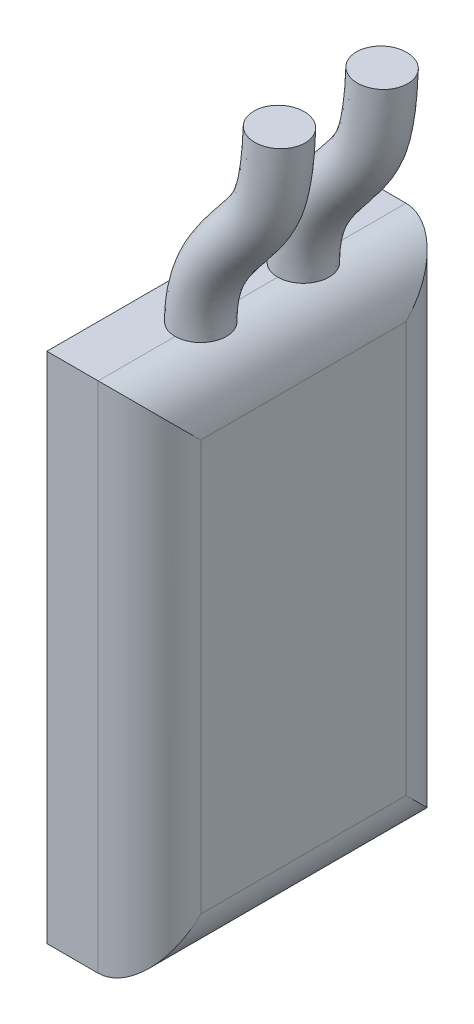
ISO-10303-21;
HEADER;
FILE_DESCRIPTION(('STEP AP214'),'2;1');
FILE_NAME('part.step','',(''),(''),'','','');
FILE_SCHEMA(('AUTOMOTIVE_DESIGN { 1 0 10303 214 1 1 1 1 }'));
ENDSEC;
DATA;
#1=APPLICATION_CONTEXT('core data for automotive mechanical design processes');
#2=APPLICATION_PROTOCOL_DEFINITION('international standard','automotive_design',2000,#1);
#3=PRODUCT_CONTEXT('',#1,'mechanical');
#4=PRODUCT('Part','Part','',(#3));
#5=PRODUCT_RELATED_PRODUCT_CATEGORY('part','',(#4));
#6=PRODUCT_DEFINITION_FORMATION('','',#4);
#7=PRODUCT_DEFINITION_CONTEXT('part definition',#1,'design');
#8=PRODUCT_DEFINITION('design','',#6,#7);
#9=PRODUCT_DEFINITION_SHAPE('','',#8);
#10=(LENGTH_UNIT() NAMED_UNIT(*) SI_UNIT(.MILLI.,.METRE.));
#11=(NAMED_UNIT(*) PLANE_ANGLE_UNIT() SI_UNIT($,.RADIAN.));
#12=(NAMED_UNIT(*) SI_UNIT($,.STERADIAN.) SOLID_ANGLE_UNIT());
#13=UNCERTAINTY_MEASURE_WITH_UNIT(LENGTH_MEASURE(1.E-05),#10,'distance_accuracy_value','');
#14=(GEOMETRIC_REPRESENTATION_CONTEXT(3) GLOBAL_UNCERTAINTY_ASSIGNED_CONTEXT((#13)) GLOBAL_UNIT_ASSIGNED_CONTEXT((#10,
#11,#12)) REPRESENTATION_CONTEXT('',''));
#15=CARTESIAN_POINT('',(0.,0.,0.));
#16=DIRECTION('',(0.,0.,1.));
#17=DIRECTION('',(1.,0.,0.));
#18=AXIS2_PLACEMENT_3D('',#15,#16,#17);
#19=CARTESIAN_POINT('',(1.48423307474751,-5.,-2.88901919499787));
#20=DIRECTION('',(1.,0.,0.));
#21=DIRECTION('',(0.,0.,-1.));
#22=AXIS2_PLACEMENT_3D('',#19,#20,#21);
#23=PLANE('',#22);
#24=DIRECTION('',(0.,0.,-1.));
#25=VECTOR('',#24,1.);
#26=CARTESIAN_POINT('',(1.48423307474751,-4.5,-2.88901919499787));
#27=LINE('',#26,#25);
#28=CARTESIAN_POINT('',(1.48423307474751,-4.5,-0.389019194997869));
#29=VERTEX_POINT('',#28);
#30=CARTESIAN_POINT('',(1.48423307474751,-4.5,-2.38901919499787));
#31=VERTEX_POINT('',#30);
#32=EDGE_CURVE('E153',#29,#31,#27,.T.);
#33=ORIENTED_EDGE('',*,*,#32,.T.);
#34=DIRECTION('',(0.,1.,0.));
#35=VECTOR('',#34,1.);
#36=CARTESIAN_POINT('',(1.48423307474751,-5.,-2.38901919499787));
#37=LINE('',#36,#35);
#38=CARTESIAN_POINT('',(1.48423307474751,-0.5,-2.38901919499787));
#39=VERTEX_POINT('',#38);
#40=EDGE_CURVE('E155',#31,#39,#37,.T.);
#41=ORIENTED_EDGE('',*,*,#40,.T.);
#42=DIRECTION('',(0.,0.,-1.));
#43=VECTOR('',#42,1.);
#44=CARTESIAN_POINT('',(1.48423307474751,-0.5,0.110980805002131));
#45=LINE('',#44,#43);
#46=CARTESIAN_POINT('',(1.48423307474751,-0.5,-0.389019194997869));
#47=VERTEX_POINT('',#46);
#48=EDGE_CURVE('E147',#39,#47,#45,.F.);
#49=ORIENTED_EDGE('',*,*,#48,.T.);
#50=DIRECTION('',(0.,1.,0.));
#51=VECTOR('',#50,1.);
#52=CARTESIAN_POINT('',(1.48423307474751,-5.,-0.389019194997869));
#53=LINE('',#52,#51);
#54=EDGE_CURVE('E151',#47,#29,#53,.F.);
#55=ORIENTED_EDGE('',*,*,#54,.T.);
#56=EDGE_LOOP('',(#33,#41,#49,#55));
#57=FACE_BOUND('',#56,.T.);
#58=ADVANCED_FACE('F35',(#57),#23,.T.);
#59=CARTESIAN_POINT('',(1.48423307474751,-5.,0.110980805002131));
#60=DIRECTION('',(0.,0.,1.));
#61=DIRECTION('',(1.,0.,0.));
#62=AXIS2_PLACEMENT_3D('',#59,#60,#61);
#63=PLANE('',#62);
#64=DIRECTION('',(1.,0.,0.));
#65=VECTOR('',#64,1.);
#66=CARTESIAN_POINT('',(1.48423307474751,-5.,0.110980805002131));
#67=LINE('',#66,#65);
#68=CARTESIAN_POINT('',(0.48423307474751,-5.,0.110980805002131));
#69=VERTEX_POINT('',#68);
#70=CARTESIAN_POINT('',(0.98423307474751,-5.,0.110980805002131));
#71=VERTEX_POINT('',#70);
#72=EDGE_CURVE('E134',#69,#71,#67,.T.);
#73=ORIENTED_EDGE('',*,*,#72,.T.);
#74=DIRECTION('',(0.,1.,0.));
#75=VECTOR('',#74,1.);
#76=CARTESIAN_POINT('',(0.98423307474751,-5.,0.110980805002131));
#77=LINE('',#76,#75);
#78=CARTESIAN_POINT('',(0.98423307474751,0.,0.110980805002131));
#79=VERTEX_POINT('',#78);
#80=EDGE_CURVE('E106',#71,#79,#77,.T.);
#81=ORIENTED_EDGE('',*,*,#80,.T.);
#82=DIRECTION('',(1.,0.,0.));
#83=VECTOR('',#82,1.);
#84=CARTESIAN_POINT('',(1.48423307474751,0.,0.110980805002131));
#85=LINE('',#84,#83);
#86=CARTESIAN_POINT('',(0.48423307474751,0.,0.110980805002131));
#87=VERTEX_POINT('',#86);
#88=EDGE_CURVE('E131',#87,#79,#85,.T.);
#89=ORIENTED_EDGE('',*,*,#88,.F.);
#90=DIRECTION('',(0.,1.,0.));
#91=VECTOR('',#90,1.);
#92=CARTESIAN_POINT('',(0.48423307474751,-5.,0.110980805002131));
#93=LINE('',#92,#91);
#94=EDGE_CURVE('E145',#69,#87,#93,.T.);
#95=ORIENTED_EDGE('',*,*,#94,.F.);
#96=EDGE_LOOP('',(#73,#81,#89,#95));
#97=FACE_BOUND('',#96,.T.);
#98=ADVANCED_FACE('F182',(#97),#63,.T.);
#99=CARTESIAN_POINT('',(0.48423307474751,-5.,-2.88901919499787));
#100=DIRECTION('',(-1.,0.,0.));
#101=DIRECTION('',(0.,0.,1.));
#102=AXIS2_PLACEMENT_3D('',#99,#100,#101);
#103=PLANE('',#102);
#104=DIRECTION('',(0.,0.,1.));
#105=VECTOR('',#104,1.);
#106=CARTESIAN_POINT('',(0.48423307474751,0.,-2.88901919499787));
#107=LINE('',#106,#105);
#108=CARTESIAN_POINT('',(0.48423307474751,0.,-2.88901919499787));
#109=VERTEX_POINT('',#108);
#110=EDGE_CURVE('E140',#109,#87,#107,.T.);
#111=ORIENTED_EDGE('',*,*,#110,.F.);
#112=DIRECTION('',(0.,1.,0.));
#113=VECTOR('',#112,1.);
#114=CARTESIAN_POINT('',(0.48423307474751,-5.,-2.88901919499787));
#115=LINE('',#114,#113);
#116=CARTESIAN_POINT('',(0.48423307474751,-5.,-2.88901919499787));
#117=VERTEX_POINT('',#116);
#118=EDGE_CURVE('E137',#117,#109,#115,.T.);
#119=ORIENTED_EDGE('',*,*,#118,.F.);
#120=DIRECTION('',(0.,0.,1.));
#121=VECTOR('',#120,1.);
#122=CARTESIAN_POINT('',(0.48423307474751,-5.,-2.88901919499787));
#123=LINE('',#122,#121);
#124=EDGE_CURVE('E130',#117,#69,#123,.T.);
#125=ORIENTED_EDGE('',*,*,#124,.T.);
#126=ORIENTED_EDGE('',*,*,#94,.T.);
#127=EDGE_LOOP('',(#111,#119,#125,#126));
#128=FACE_BOUND('',#127,.T.);
#129=ADVANCED_FACE('F188',(#128),#103,.T.);
#130=CARTESIAN_POINT('',(1.48423307474751,-5.,-2.88901919499787));
#131=DIRECTION('',(0.,0.,-1.));
#132=DIRECTION('',(-1.,0.,0.));
#133=AXIS2_PLACEMENT_3D('',#130,#131,#132);
#134=PLANE('',#133);
#135=DIRECTION('',(-1.,0.,0.));
#136=VECTOR('',#135,1.);
#137=CARTESIAN_POINT('',(1.48423307474751,0.,-2.88901919499787));
#138=LINE('',#137,#136);
#139=CARTESIAN_POINT('',(0.98423307474751,0.,-2.88901919499787));
#140=VERTEX_POINT('',#139);
#141=EDGE_CURVE('E138',#140,#109,#138,.T.);
#142=ORIENTED_EDGE('',*,*,#141,.F.);
#143=DIRECTION('',(0.,1.,0.));
#144=VECTOR('',#143,1.);
#145=CARTESIAN_POINT('',(0.98423307474751,-5.,-2.88901919499787));
#146=LINE('',#145,#144);
#147=CARTESIAN_POINT('',(0.98423307474751,-5.,-2.88901919499787));
#148=VERTEX_POINT('',#147);
#149=EDGE_CURVE('E158',#140,#148,#146,.F.);
#150=ORIENTED_EDGE('',*,*,#149,.T.);
#151=DIRECTION('',(-1.,0.,0.));
#152=VECTOR('',#151,1.);
#153=CARTESIAN_POINT('',(1.48423307474751,-5.,-2.88901919499787));
#154=LINE('',#153,#152);
#155=EDGE_CURVE('E128',#148,#117,#154,.T.);
#156=ORIENTED_EDGE('',*,*,#155,.T.);
#157=ORIENTED_EDGE('',*,*,#118,.T.);
#158=EDGE_LOOP('',(#142,#150,#156,#157));
#159=FACE_BOUND('',#158,.T.);
#160=ADVANCED_FACE('F194',(#159),#134,.T.);
#161=CARTESIAN_POINT('',(0.,-5.,0.));
#162=DIRECTION('',(0.,-1.,0.));
#163=DIRECTION('',(0.,0.,-1.));
#164=AXIS2_PLACEMENT_3D('',#161,#162,#163);
#165=PLANE('',#164);
#166=ORIENTED_EDGE('',*,*,#155,.F.);
#167=DIRECTION('',(0.,0.,-1.));
#168=VECTOR('',#167,1.);
#169=CARTESIAN_POINT('',(0.98423307474751,-5.,0.));
#170=LINE('',#169,#168);
#171=EDGE_CURVE('E161',#148,#71,#170,.F.);
#172=ORIENTED_EDGE('',*,*,#171,.T.);
#173=ORIENTED_EDGE('',*,*,#72,.F.);
#174=ORIENTED_EDGE('',*,*,#124,.F.);
#175=EDGE_LOOP('',(#166,#172,#173,#174));
#176=FACE_BOUND('',#175,.T.);
#177=ADVANCED_FACE('F192',(#176),#165,.T.);
#178=CARTESIAN_POINT('',(0.,0.,0.));
#179=DIRECTION('',(0.,-1.,0.));
#180=DIRECTION('',(0.,0.,-1.));
#181=AXIS2_PLACEMENT_3D('',#178,#179,#180);
#182=PLANE('',#181);
#183=DIRECTION('',(0.,0.,-1.));
#184=VECTOR('',#183,1.);
#185=CARTESIAN_POINT('',(0.98423307474751,0.,-2.88901919499787));
#186=LINE('',#185,#184);
#187=CARTESIAN_POINT('',(0.98423307474751,0.,-1.13901919499787));
#188=VERTEX_POINT('',#187);
#189=CARTESIAN_POINT('',(0.98423307474751,0.,-1.63901919499787));
#190=VERTEX_POINT('',#189);
#191=EDGE_CURVE('E111',#188,#190,#186,.T.);
#192=ORIENTED_EDGE('',*,*,#191,.T.);
#193=CARTESIAN_POINT('',(0.98423307474751,0.,-1.88901919499787));
#194=DIRECTION('',(0.,1.,0.));
#195=DIRECTION('',(0.,0.,1.));
#196=AXIS2_PLACEMENT_3D('',#193,#194,#195);
#197=CIRCLE('',#196,0.25);
#198=CARTESIAN_POINT('',(0.98423307474751,0.,-2.13901919499787));
#199=VERTEX_POINT('',#198);
#200=EDGE_CURVE('E109',#199,#190,#197,.T.);
#201=ORIENTED_EDGE('',*,*,#200,.F.);
#202=EDGE_CURVE('E99',#199,#140,#186,.T.);
#203=ORIENTED_EDGE('',*,*,#202,.T.);
#204=ORIENTED_EDGE('',*,*,#141,.T.);
#205=ORIENTED_EDGE('',*,*,#110,.T.);
#206=ORIENTED_EDGE('',*,*,#88,.T.);
#207=CARTESIAN_POINT('',(0.98423307474751,0.,-0.63901919499787));
#208=VERTEX_POINT('',#207);
#209=EDGE_CURVE('E44',#79,#208,#186,.T.);
#210=ORIENTED_EDGE('',*,*,#209,.T.);
#211=CARTESIAN_POINT('',(0.98423307474751,0.,-0.889019194997869));
#212=DIRECTION('',(0.,1.,0.));
#213=DIRECTION('',(0.,0.,1.));
#214=AXIS2_PLACEMENT_3D('',#211,#212,#213);
#215=CIRCLE('',#214,0.25);
#216=EDGE_CURVE('E11',#188,#208,#215,.T.);
#217=ORIENTED_EDGE('',*,*,#216,.F.);
#218=EDGE_LOOP('',(#192,#201,#203,#204,#205,#206,#210,#217));
#219=FACE_BOUND('',#218,.T.);
#220=ADVANCED_FACE('F110',(#219),#182,.F.);
#221=CARTESIAN_POINT('',(0.98423307474751,-5.,-0.389019194997869));
#222=DIRECTION('',(0.,1.,0.));
#223=DIRECTION('',(0.,0.,1.));
#224=AXIS2_PLACEMENT_3D('',#221,#222,#223);
#225=CYLINDRICAL_SURFACE('',#224,0.5);
#226=CARTESIAN_POINT('',(0.98423307474751,-0.5,-0.389019194997869));
#227=DIRECTION('',(0.,-0.707106781186547,0.707106781186547));
#228=DIRECTION('',(0.,0.707106781186547,0.707106781186547));
#229=AXIS2_PLACEMENT_3D('',#226,#227,#228);
#230=ELLIPSE('',#229,0.707106781186547,0.5);
#231=EDGE_CURVE('E167',#79,#47,#230,.F.);
#232=ORIENTED_EDGE('',*,*,#231,.F.);
#233=ORIENTED_EDGE('',*,*,#80,.F.);
#234=CARTESIAN_POINT('',(0.98423307474751,-4.5,-0.389019194997869));
#235=DIRECTION('',(0.,0.707106781186547,0.707106781186547));
#236=DIRECTION('',(0.,0.707106781186547,-0.707106781186547));
#237=AXIS2_PLACEMENT_3D('',#234,#235,#236);
#238=ELLIPSE('',#237,0.707106781186547,0.5);
#239=EDGE_CURVE('E39',#29,#71,#238,.F.);
#240=ORIENTED_EDGE('',*,*,#239,.F.);
#241=ORIENTED_EDGE('',*,*,#54,.F.);
#242=EDGE_LOOP('',(#232,#233,#240,#241));
#243=FACE_BOUND('',#242,.T.);
#244=ADVANCED_FACE('F37',(#243),#225,.T.);
#245=CARTESIAN_POINT('',(0.98423307474751,-4.5,-2.88901919499787));
#246=DIRECTION('',(0.,0.,-1.));
#247=DIRECTION('',(-1.,0.,0.));
#248=AXIS2_PLACEMENT_3D('',#245,#246,#247);
#249=CYLINDRICAL_SURFACE('',#248,0.5);
#250=ORIENTED_EDGE('',*,*,#239,.T.);
#251=ORIENTED_EDGE('',*,*,#171,.F.);
#252=CARTESIAN_POINT('',(0.98423307474751,-4.5,-2.38901919499787));
#253=DIRECTION('',(0.,0.707106781186547,-0.707106781186547));
#254=DIRECTION('',(0.,-0.707106781186547,-0.707106781186547));
#255=AXIS2_PLACEMENT_3D('',#252,#253,#254);
#256=ELLIPSE('',#255,0.707106781186547,0.5);
#257=EDGE_CURVE('E166',#31,#148,#256,.T.);
#258=ORIENTED_EDGE('',*,*,#257,.F.);
#259=ORIENTED_EDGE('',*,*,#32,.F.);
#260=EDGE_LOOP('',(#250,#251,#258,#259));
#261=FACE_BOUND('',#260,.T.);
#262=ADVANCED_FACE('F175',(#261),#249,.T.);
#263=CARTESIAN_POINT('',(0.98423307474751,-0.5,0.));
#264=DIRECTION('',(0.,0.,1.));
#265=DIRECTION('',(1.,0.,0.));
#266=AXIS2_PLACEMENT_3D('',#263,#264,#265);
#267=CYLINDRICAL_SURFACE('',#266,0.5);
#268=ORIENTED_EDGE('',*,*,#231,.T.);
#269=ORIENTED_EDGE('',*,*,#48,.F.);
#270=CARTESIAN_POINT('',(0.98423307474751,-0.5,-2.38901919499787));
#271=DIRECTION('',(0.,0.707106781186547,0.707106781186547));
#272=DIRECTION('',(0.,-0.707106781186547,0.707106781186547));
#273=AXIS2_PLACEMENT_3D('',#270,#271,#272);
#274=ELLIPSE('',#273,0.707106781186547,0.5);
#275=EDGE_CURVE('E104',#140,#39,#274,.F.);
#276=ORIENTED_EDGE('',*,*,#275,.F.);
#277=ORIENTED_EDGE('',*,*,#202,.F.);
#278=EDGE_CURVE('E53',#190,#199,#186,.T.);
#279=ORIENTED_EDGE('',*,*,#278,.F.);
#280=ORIENTED_EDGE('',*,*,#191,.F.);
#281=EDGE_CURVE('E164',#208,#188,#186,.T.);
#282=ORIENTED_EDGE('',*,*,#281,.F.);
#283=ORIENTED_EDGE('',*,*,#209,.F.);
#284=EDGE_LOOP('',(#268,#269,#276,#277,#279,#280,#282,#283));
#285=FACE_BOUND('',#284,.T.);
#286=ADVANCED_FACE('F102',(#285),#267,.T.);
#287=CARTESIAN_POINT('',(0.98423307474751,-5.,-2.38901919499787));
#288=DIRECTION('',(0.,1.,0.));
#289=DIRECTION('',(0.,0.,1.));
#290=AXIS2_PLACEMENT_3D('',#287,#288,#289);
#291=CYLINDRICAL_SURFACE('',#290,0.5);
#292=ORIENTED_EDGE('',*,*,#257,.T.);
#293=ORIENTED_EDGE('',*,*,#149,.F.);
#294=ORIENTED_EDGE('',*,*,#275,.T.);
#295=ORIENTED_EDGE('',*,*,#40,.F.);
#296=EDGE_LOOP('',(#292,#293,#294,#295));
#297=FACE_BOUND('',#296,.T.);
#298=ADVANCED_FACE('F197',(#297),#291,.T.);
#299=CARTESIAN_POINT('',(0.98423307474751,0.,-0.889019194997869));
#300=DIRECTION('',(0.,1.,0.));
#301=DIRECTION('',(0.,0.,1.));
#302=AXIS2_PLACEMENT_3D('',#299,#300,#301);
#303=PLANE('',#302);
#304=EDGE_CURVE('E46',#208,#188,#215,.T.);
#305=ORIENTED_EDGE('',*,*,#304,.F.);
#306=ORIENTED_EDGE('',*,*,#281,.T.);
#307=EDGE_LOOP('',(#305,#306));
#308=FACE_BOUND('',#307,.T.);
#309=ADVANCED_FACE('F211',(#308),#303,.F.);
#310=CARTESIAN_POINT('',(1.75135244304727,2.02639216008394,-0.889019194997869));
#311=DIRECTION('',(0.0379403503412822,0.999280005712103,0.));
#312=DIRECTION('',(0.,0.,1.));
#313=AXIS2_PLACEMENT_3D('',#310,#311,#312);
#314=PLANE('',#313);
#315=CARTESIAN_POINT('',(1.75135244304727,2.02639216008394,-0.889019194997869));
#316=DIRECTION('',(0.0379403503412822,0.999280005712103,0.));
#317=DIRECTION('',(0.,0.,1.));
#318=AXIS2_PLACEMENT_3D('',#315,#316,#317);
#319=CIRCLE('',#318,0.25);
#320=CARTESIAN_POINT('',(1.75135244304727,2.02639216008394,-0.63901919499787));
#321=VERTEX_POINT('',#320);
#322=EDGE_CURVE('E125',#321,#321,#319,.T.);
#323=ORIENTED_EDGE('',*,*,#322,.T.);
#324=EDGE_LOOP('',(#323));
#325=FACE_BOUND('',#324,.T.);
#326=ADVANCED_FACE('F270',(#325),#314,.T.);
#327=CARTESIAN_POINT('',(0.98423307474751,0.,-0.63901919499787));
#328=CARTESIAN_POINT('',(0.98423312309448,0.271044095655659,-0.63901919499787));
#329=CARTESIAN_POINT('',(1.06014931673696,0.469163992443003,-0.63901919499787));
#330=CARTESIAN_POINT('',(1.2679153392717,0.807728236849933,-0.63901919499787));
#331=CARTESIAN_POINT('',(1.39976534514507,0.948172294550459,-0.63901919499787));
#332=CARTESIAN_POINT('',(1.57197805541802,1.18785181937252,-0.63901919499787));
#333=CARTESIAN_POINT('',(1.6265087049878,1.27627524142727,-0.63901919499787));
#334=CARTESIAN_POINT('',(1.71079655045471,1.55333751037708,-0.63901919499787));
#335=CARTESIAN_POINT('',(1.74055381119004,1.74197598527765,-0.639019194997931));
#336=CARTESIAN_POINT('',(1.75135244304727,2.02639216008394,-0.63901919499787));
#337=CARTESIAN_POINT('',(1.48423307474751,0.,-0.63901919499787));
#338=CARTESIAN_POINT('',(1.48423315818163,0.177681389748147,-0.63901919499787));
#339=CARTESIAN_POINT('',(1.52046835122393,0.263317431057683,-0.63901919499787));
#340=CARTESIAN_POINT('',(1.65990687784476,0.490538769791646,-0.63901919499787));
#341=CARTESIAN_POINT('',(1.78026629189063,0.620854782571924,-0.63901919499787));
#342=CARTESIAN_POINT('',(1.99181506255354,0.915280999351527,-0.63901919499787));
#343=CARTESIAN_POINT('',(2.0871515942167,1.0725325192244,-0.63901919499787));
#344=CARTESIAN_POINT('',(2.20686156621734,1.46603043524842,-0.63901919499787));
#345=CARTESIAN_POINT('',(2.23919055854325,1.69658173301913,-0.639019194997931));
#346=CARTESIAN_POINT('',(2.25099244590332,2.0074219849133,-0.63901919499787));
#347=CARTESIAN_POINT('',(1.48423307474751,0.,-1.13901919499787));
#348=CARTESIAN_POINT('',(1.48423315818163,0.177681389748012,-1.13901919499787));
#349=CARTESIAN_POINT('',(1.52046835122393,0.263317431057683,-1.13901919499787));
#350=CARTESIAN_POINT('',(1.65990687784476,0.490538769791646,-1.13901919499787));
#351=CARTESIAN_POINT('',(1.78026629189063,0.620854782571924,-1.13901919499787));
#352=CARTESIAN_POINT('',(1.99181506255354,0.915280999351527,-1.13901919499787));
#353=CARTESIAN_POINT('',(2.08715159421671,1.07253251922444,-1.13901919499787));
#354=CARTESIAN_POINT('',(2.20686156621732,1.46603043524838,-1.13901919499787));
#355=CARTESIAN_POINT('',(2.23919055854325,1.69658173301925,-1.13901919499787));
#356=CARTESIAN_POINT('',(2.25099244590332,2.0074219849133,-1.13901919499787));
#357=CARTESIAN_POINT('',(0.98423307474751,0.,-1.13901919499787));
#358=CARTESIAN_POINT('',(0.98423312309448,0.271044095655523,-1.13901919499787));
#359=CARTESIAN_POINT('',(1.06014931673696,0.469163992443003,-1.13901919499787));
#360=CARTESIAN_POINT('',(1.2679153392717,0.807728236849933,-1.13901919499787));
#361=CARTESIAN_POINT('',(1.39976534514507,0.948172294550459,-1.13901919499787));
#362=CARTESIAN_POINT('',(1.57197805541802,1.18785181937252,-1.13901919499787));
#363=CARTESIAN_POINT('',(1.62650870498782,1.2762752414273,-1.13901919499787));
#364=CARTESIAN_POINT('',(1.71079655045469,1.55333751037705,-1.13901919499787));
#365=CARTESIAN_POINT('',(1.74055381119004,1.74197598527765,-1.13901919499787));
#366=CARTESIAN_POINT('',(1.75135244304727,2.02639216008394,-1.13901919499787));
#367=CARTESIAN_POINT('',(0.484233074747511,0.,-1.13901919499787));
#368=CARTESIAN_POINT('',(0.484233088007333,0.364406801563035,-1.13901919499787));
#369=CARTESIAN_POINT('',(0.599830282249984,0.675010553828323,-1.13901919499787));
#370=CARTESIAN_POINT('',(0.875923800698632,1.12491770390822,-1.13901919499787));
#371=CARTESIAN_POINT('',(1.01926439839952,1.27548980652899,-1.13901919499787));
#372=CARTESIAN_POINT('',(1.15214104828251,1.46042263939352,-1.13901919499787));
#373=CARTESIAN_POINT('',(1.16586581575892,1.48001796363015,-1.13901919499787));
#374=CARTESIAN_POINT('',(1.21473153469206,1.64064458550572,-1.13901919499787));
#375=CARTESIAN_POINT('',(1.24191706383683,1.78737023753604,-1.13901919499787));
#376=CARTESIAN_POINT('',(1.25171244019122,2.04536233525458,-1.13901919499787));
#377=CARTESIAN_POINT('',(0.484233074747511,0.,-0.63901919499787));
#378=CARTESIAN_POINT('',(0.484233088007333,0.364406801563171,-0.63901919499787));
#379=CARTESIAN_POINT('',(0.599830282249984,0.675010553828322,-0.63901919499787));
#380=CARTESIAN_POINT('',(0.875923800698632,1.12491770390822,-0.63901919499787));
#381=CARTESIAN_POINT('',(1.01926439839952,1.27548980652899,-0.63901919499787));
#382=CARTESIAN_POINT('',(1.15214104828251,1.46042263939352,-0.63901919499787));
#383=CARTESIAN_POINT('',(1.16586581575891,1.48001796363013,-0.63901919499787));
#384=CARTESIAN_POINT('',(1.21473153469208,1.64064458550575,-0.63901919499787));
#385=CARTESIAN_POINT('',(1.24191706383683,1.78737023753616,-0.639019194997931));
#386=CARTESIAN_POINT('',(1.25171244019122,2.04536233525458,-0.63901919499787));
#387=CARTESIAN_POINT('',(0.98423307474751,0.,-0.63901919499787));
#388=CARTESIAN_POINT('',(0.98423312309448,0.271044095655659,-0.63901919499787));
#389=CARTESIAN_POINT('',(1.06014931673696,0.469163992443003,-0.63901919499787));
#390=CARTESIAN_POINT('',(1.2679153392717,0.807728236849933,-0.63901919499787));
#391=CARTESIAN_POINT('',(1.39976534514507,0.948172294550459,-0.63901919499787));
#392=CARTESIAN_POINT('',(1.57197805541802,1.18785181937252,-0.63901919499787));
#393=CARTESIAN_POINT('',(1.6265087049878,1.27627524142727,-0.63901919499787));
#394=CARTESIAN_POINT('',(1.71079655045471,1.55333751037708,-0.63901919499787));
#395=CARTESIAN_POINT('',(1.74055381119004,1.74197598527765,-0.639019194997931));
#396=CARTESIAN_POINT('',(1.75135244304727,2.02639216008394,-0.63901919499787));
#397=(BOUNDED_SURFACE() B_SPLINE_SURFACE(3,3,((#327,#328,#329,#330,#331,#332,#333,#334,#335,
#336),(#337,#338,#339,#340,#341,#342,#343,#344,#345,#346),(#347,#348,#349,#350,#351,#352,#353,
#354,#355,#356),(#357,#358,#359,#360,#361,#362,#363,#364,#365,#366),(#367,#368,#369,#370,#371,
#372,#373,#374,#375,#376),(#377,#378,#379,#380,#381,#382,#383,#384,#385,#386),(#387,#388,#389,
#390,#391,#392,#393,#394,#395,#396)),.UNSPECIFIED.,.T.,.F.,.F.) B_SPLINE_SURFACE_WITH_KNOTS((4,
3,4),(4,2,2,2,4),(0.,0.5,1.),(0.,0.324794237981778,0.649588475963556,0.824794237981778,1.),
.UNSPECIFIED.) GEOMETRIC_REPRESENTATION_ITEM() RATIONAL_B_SPLINE_SURFACE(((1.,1.,1.,1.,1.,1.,1.,
1.,1.,1.),(0.333333333333333,0.333333333333333,0.333333333333333,0.333333333333333,
0.333333333333333,0.333333333333333,0.333333333333333,0.333333333333333,0.333333333333333,
0.333333333333333),(0.333333333333333,0.333333333333333,0.333333333333333,0.333333333333333,
0.333333333333333,0.333333333333333,0.333333333333333,0.333333333333333,0.333333333333333,
0.333333333333333),(1.,1.,1.,1.,1.,1.,1.,1.,1.,1.),(0.333333333333333,0.333333333333333,
0.333333333333333,0.333333333333333,0.333333333333333,0.333333333333333,0.333333333333333,
0.333333333333333,0.333333333333333,0.333333333333333),(0.333333333333333,0.333333333333333,
0.333333333333333,0.333333333333333,0.333333333333333,0.333333333333333,0.333333333333333,
0.333333333333333,0.333333333333333,0.333333333333333),(1.,1.,1.,1.,1.,1.,1.,1.,1.,1.))) REPRESENTATION_ITEM('') SURFACE());
#398=ORIENTED_EDGE('',*,*,#322,.F.);
#399=EDGE_LOOP('',(#398));
#400=FACE_BOUND('',#399,.T.);
#401=ORIENTED_EDGE('',*,*,#304,.T.);
#402=ORIENTED_EDGE('',*,*,#216,.T.);
#403=EDGE_LOOP('',(#401,#402));
#404=FACE_BOUND('',#403,.T.);
#405=ADVANCED_FACE('F272',(#400,#404),#397,.T.);
#406=CARTESIAN_POINT('',(0.98423307474751,0.,-1.88901919499787));
#407=DIRECTION('',(0.,1.,0.));
#408=DIRECTION('',(0.,0.,1.));
#409=AXIS2_PLACEMENT_3D('',#406,#407,#408);
#410=PLANE('',#409);
#411=EDGE_CURVE('E115',#190,#199,#197,.T.);
#412=ORIENTED_EDGE('',*,*,#411,.F.);
#413=ORIENTED_EDGE('',*,*,#278,.T.);
#414=EDGE_LOOP('',(#412,#413));
#415=FACE_BOUND('',#414,.T.);
#416=ADVANCED_FACE('F118',(#415),#410,.F.);
#417=CARTESIAN_POINT('',(1.75135244304727,2.02639216008394,-1.88901919499787));
#418=DIRECTION('',(0.0379403503412822,0.999280005712103,0.));
#419=DIRECTION('',(0.,0.,1.));
#420=AXIS2_PLACEMENT_3D('',#417,#418,#419);
#421=PLANE('',#420);
#422=CARTESIAN_POINT('',(1.75135244304727,2.02639216008394,-1.88901919499787));
#423=DIRECTION('',(0.0379403503412822,0.999280005712103,0.));
#424=DIRECTION('',(0.,0.,1.));
#425=AXIS2_PLACEMENT_3D('',#422,#423,#424);
#426=CIRCLE('',#425,0.25);
#427=CARTESIAN_POINT('',(1.75135244304727,2.02639216008394,-1.63901919499787));
#428=VERTEX_POINT('',#427);
#429=EDGE_CURVE('E120',#428,#428,#426,.T.);
#430=ORIENTED_EDGE('',*,*,#429,.T.);
#431=EDGE_LOOP('',(#430));
#432=FACE_BOUND('',#431,.T.);
#433=ADVANCED_FACE('F298',(#432),#421,.T.);
#434=CARTESIAN_POINT('',(0.98423307474751,0.,-1.63901919499787));
#435=CARTESIAN_POINT('',(0.98423312309448,0.271044095655388,-1.63901919499787));
#436=CARTESIAN_POINT('',(1.06014931673694,0.469163992443003,-1.63901919499787));
#437=CARTESIAN_POINT('',(1.26791533927172,0.807728236849933,-1.63901919499787));
#438=CARTESIAN_POINT('',(1.39976534514507,0.948172294550458,-1.63901919499787));
#439=CARTESIAN_POINT('',(1.57197805541802,1.18785181937252,-1.63901919499787));
#440=CARTESIAN_POINT('',(1.62650870498783,1.27627524142733,-1.63901919499787));
#441=CARTESIAN_POINT('',(1.71079655045468,1.55333751037702,-1.63901919499787));
#442=CARTESIAN_POINT('',(1.74055381119004,1.74197598527765,-1.63901919499787));
#443=CARTESIAN_POINT('',(1.75135244304727,2.02639216008394,-1.63901919499787));
#444=CARTESIAN_POINT('',(1.48423307474751,0.,-1.63901919499787));
#445=CARTESIAN_POINT('',(1.48423315818163,0.177681389747876,-1.63901919499787));
#446=CARTESIAN_POINT('',(1.52046835122392,0.263317431057689,-1.63901919499787));
#447=CARTESIAN_POINT('',(1.65990687784477,0.49053876979164,-1.63901919499787));
#448=CARTESIAN_POINT('',(1.78026629189064,0.620854782571913,-1.63901919499787));
#449=CARTESIAN_POINT('',(1.99181506255354,0.915280999351532,-1.63901919499787));
#450=CARTESIAN_POINT('',(2.08715159421675,1.07253251922448,-1.63901919499787));
#451=CARTESIAN_POINT('',(2.20686156621729,1.46603043524834,-1.63901919499787));
#452=CARTESIAN_POINT('',(2.23919055854325,1.69658173301913,-1.63901919499787));
#453=CARTESIAN_POINT('',(2.25099244590332,2.0074219849133,-1.63901919499787));
#454=CARTESIAN_POINT('',(1.48423307474751,0.,-2.13901919499787));
#455=CARTESIAN_POINT('',(1.48423315818163,0.17768138974774,-2.13901919499787));
#456=CARTESIAN_POINT('',(1.52046835122392,0.263317431057689,-2.13901919499787));
#457=CARTESIAN_POINT('',(1.65990687784477,0.49053876979164,-2.13901919499787));
#458=CARTESIAN_POINT('',(1.78026629189064,0.620854782571913,-2.13901919499787));
#459=CARTESIAN_POINT('',(1.99181506255354,0.915280999351532,-2.13901919499787));
#460=CARTESIAN_POINT('',(2.08715159421674,1.07253251922451,-2.13901919499787));
#461=CARTESIAN_POINT('',(2.2068615662173,1.46603043524831,-2.13901919499787));
#462=CARTESIAN_POINT('',(2.23919055854325,1.69658173301888,-2.13901919499787));
#463=CARTESIAN_POINT('',(2.25099244590332,2.0074219849133,-2.13901919499787));
#464=CARTESIAN_POINT('',(0.98423307474751,0.,-2.13901919499787));
#465=CARTESIAN_POINT('',(0.98423312309448,0.271044095655252,-2.13901919499787));
#466=CARTESIAN_POINT('',(1.06014931673694,0.469163992443003,-2.13901919499787));
#467=CARTESIAN_POINT('',(1.26791533927172,0.807728236849933,-2.13901919499787));
#468=CARTESIAN_POINT('',(1.39976534514507,0.948172294550458,-2.13901919499787));
#469=CARTESIAN_POINT('',(1.57197805541802,1.18785181937252,-2.13901919499787));
#470=CARTESIAN_POINT('',(1.62650870498783,1.27627524142736,-2.13901919499787));
#471=CARTESIAN_POINT('',(1.71079655045468,1.55333751037699,-2.13901919499787));
#472=CARTESIAN_POINT('',(1.74055381119004,1.7419759852774,-2.13901919499787));
#473=CARTESIAN_POINT('',(1.75135244304727,2.02639216008394,-2.13901919499787));
#474=CARTESIAN_POINT('',(0.484233074747512,0.,-2.13901919499787));
#475=CARTESIAN_POINT('',(0.484233088007333,0.364406801562763,-2.13901919499787));
#476=CARTESIAN_POINT('',(0.599830282249952,0.675010553828317,-2.13901919499787));
#477=CARTESIAN_POINT('',(0.875923800698665,1.12491770390823,-2.13901919499787));
#478=CARTESIAN_POINT('',(1.01926439839951,1.275489806529,-2.13901919499787));
#479=CARTESIAN_POINT('',(1.15214104828251,1.46042263939351,-2.13901919499787));
#480=CARTESIAN_POINT('',(1.16586581575893,1.4800179636302,-2.13901919499787));
#481=CARTESIAN_POINT('',(1.21473153469206,1.64064458550567,-2.13901919499787));
#482=CARTESIAN_POINT('',(1.24191706383683,1.78737023753591,-2.13901919499787));
#483=CARTESIAN_POINT('',(1.25171244019122,2.04536233525458,-2.13901919499787));
#484=CARTESIAN_POINT('',(0.484233074747512,0.,-1.63901919499787));
#485=CARTESIAN_POINT('',(0.484233088007333,0.364406801562899,-1.63901919499787));
#486=CARTESIAN_POINT('',(0.599830282249952,0.675010553828317,-1.63901919499787));
#487=CARTESIAN_POINT('',(0.875923800698665,1.12491770390823,-1.63901919499787));
#488=CARTESIAN_POINT('',(1.01926439839951,1.275489806529,-1.63901919499787));
#489=CARTESIAN_POINT('',(1.15214104828251,1.46042263939351,-1.63901919499787));
#490=CARTESIAN_POINT('',(1.16586581575892,1.48001796363017,-1.63901919499787));
#491=CARTESIAN_POINT('',(1.21473153469207,1.6406445855057,-1.63901919499787));
#492=CARTESIAN_POINT('',(1.24191706383683,1.78737023753616,-1.63901919499787));
#493=CARTESIAN_POINT('',(1.25171244019122,2.04536233525458,-1.63901919499787));
#494=CARTESIAN_POINT('',(0.98423307474751,0.,-1.63901919499787));
#495=CARTESIAN_POINT('',(0.98423312309448,0.271044095655388,-1.63901919499787));
#496=CARTESIAN_POINT('',(1.06014931673694,0.469163992443003,-1.63901919499787));
#497=CARTESIAN_POINT('',(1.26791533927172,0.807728236849933,-1.63901919499787));
#498=CARTESIAN_POINT('',(1.39976534514507,0.948172294550458,-1.63901919499787));
#499=CARTESIAN_POINT('',(1.57197805541802,1.18785181937252,-1.63901919499787));
#500=CARTESIAN_POINT('',(1.62650870498783,1.27627524142733,-1.63901919499787));
#501=CARTESIAN_POINT('',(1.71079655045468,1.55333751037702,-1.63901919499787));
#502=CARTESIAN_POINT('',(1.74055381119004,1.74197598527765,-1.63901919499787));
#503=CARTESIAN_POINT('',(1.75135244304727,2.02639216008394,-1.63901919499787));
#504=(BOUNDED_SURFACE() B_SPLINE_SURFACE(3,3,((#434,#435,#436,#437,#438,#439,#440,#441,#442,
#443),(#444,#445,#446,#447,#448,#449,#450,#451,#452,#453),(#454,#455,#456,#457,#458,#459,#460,
#461,#462,#463),(#464,#465,#466,#467,#468,#469,#470,#471,#472,#473),(#474,#475,#476,#477,#478,
#479,#480,#481,#482,#483),(#484,#485,#486,#487,#488,#489,#490,#491,#492,#493),(#494,#495,#496,
#497,#498,#499,#500,#501,#502,#503)),.UNSPECIFIED.,.T.,.F.,.F.) B_SPLINE_SURFACE_WITH_KNOTS((4,
3,4),(4,2,2,2,4),(0.,0.5,1.),(0.,0.324794237981778,0.649588475963556,0.824794237981778,1.),
.UNSPECIFIED.) GEOMETRIC_REPRESENTATION_ITEM() RATIONAL_B_SPLINE_SURFACE(((1.,1.,1.,1.,1.,1.,1.,
1.,1.,1.),(0.333333333333333,0.333333333333333,0.333333333333333,0.333333333333333,
0.333333333333333,0.333333333333333,0.333333333333333,0.333333333333333,0.333333333333333,
0.333333333333333),(0.333333333333333,0.333333333333333,0.333333333333333,0.333333333333333,
0.333333333333333,0.333333333333333,0.333333333333333,0.333333333333333,0.333333333333333,
0.333333333333333),(1.,1.,1.,1.,1.,1.,1.,1.,1.,1.),(0.333333333333333,0.333333333333333,
0.333333333333333,0.333333333333333,0.333333333333333,0.333333333333333,0.333333333333333,
0.333333333333333,0.333333333333333,0.333333333333333),(0.333333333333333,0.333333333333333,
0.333333333333333,0.333333333333333,0.333333333333333,0.333333333333333,0.333333333333333,
0.333333333333333,0.333333333333333,0.333333333333333),(1.,1.,1.,1.,1.,1.,1.,1.,1.,1.))) REPRESENTATION_ITEM('') SURFACE());
#505=ORIENTED_EDGE('',*,*,#429,.F.);
#506=EDGE_LOOP('',(#505));
#507=FACE_BOUND('',#506,.T.);
#508=ORIENTED_EDGE('',*,*,#411,.T.);
#509=ORIENTED_EDGE('',*,*,#200,.T.);
#510=EDGE_LOOP('',(#508,#509));
#511=FACE_BOUND('',#510,.T.);
#512=ADVANCED_FACE('F119',(#507,#511),#504,.T.);
#513=CLOSED_SHELL('',(#58,#98,#129,#160,#177,#220,#244,#262,#286,#298,#309,#326,#405,#416,#433,#512));
#514=MANIFOLD_SOLID_BREP('B2',#513);
#515=ADVANCED_BREP_SHAPE_REPRESENTATION('',(#18,#514),#14);
#516=SHAPE_DEFINITION_REPRESENTATION(#9,#515);
ENDSEC;
END-ISO-10303-21;
